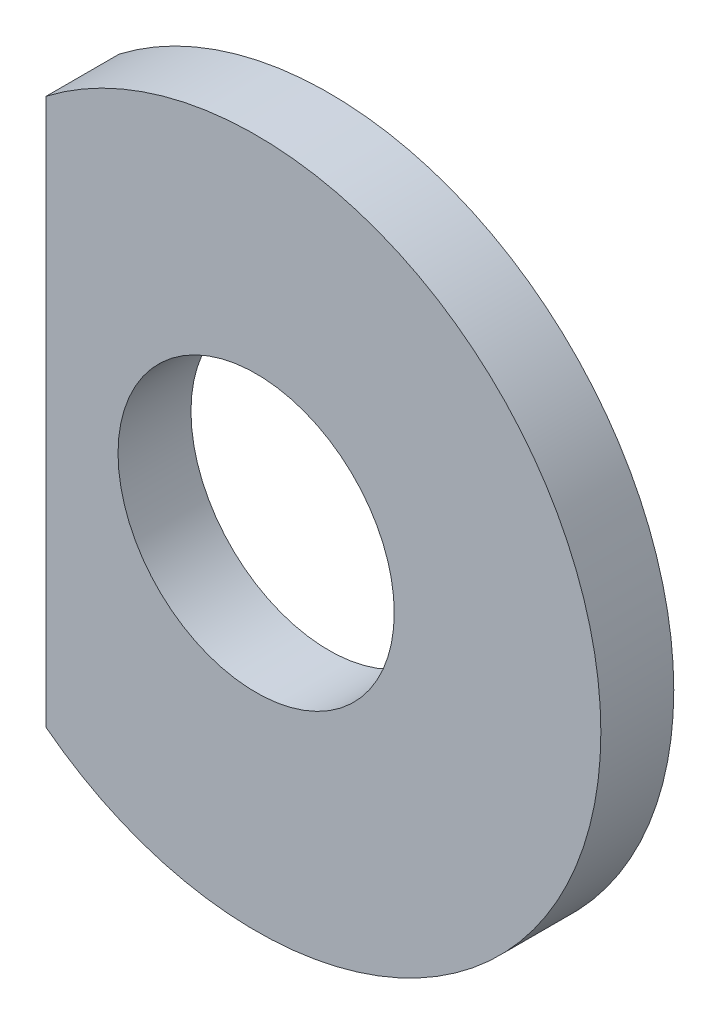
ISO-10303-21;
HEADER;
FILE_DESCRIPTION(('STEP AP214'),'2;1');
FILE_NAME('part.step','',(''),(''),'','','');
FILE_SCHEMA(('AUTOMOTIVE_DESIGN { 1 0 10303 214 1 1 1 1 }'));
ENDSEC;
DATA;
#1=APPLICATION_CONTEXT('core data for automotive mechanical design processes');
#2=APPLICATION_PROTOCOL_DEFINITION('international standard','automotive_design',2000,#1);
#3=PRODUCT_CONTEXT('',#1,'mechanical');
#4=PRODUCT('Part','Part','',(#3));
#5=PRODUCT_RELATED_PRODUCT_CATEGORY('part','',(#4));
#6=PRODUCT_DEFINITION_FORMATION('','',#4);
#7=PRODUCT_DEFINITION_CONTEXT('part definition',#1,'design');
#8=PRODUCT_DEFINITION('design','',#6,#7);
#9=PRODUCT_DEFINITION_SHAPE('','',#8);
#10=(LENGTH_UNIT() NAMED_UNIT(*) SI_UNIT(.MILLI.,.METRE.));
#11=(NAMED_UNIT(*) PLANE_ANGLE_UNIT() SI_UNIT($,.RADIAN.));
#12=(NAMED_UNIT(*) SI_UNIT($,.STERADIAN.) SOLID_ANGLE_UNIT());
#13=UNCERTAINTY_MEASURE_WITH_UNIT(LENGTH_MEASURE(1.E-05),#10,'distance_accuracy_value','');
#14=(GEOMETRIC_REPRESENTATION_CONTEXT(3) GLOBAL_UNCERTAINTY_ASSIGNED_CONTEXT((#13)) GLOBAL_UNIT_ASSIGNED_CONTEXT((#10,
#11,#12)) REPRESENTATION_CONTEXT('',''));
#15=CARTESIAN_POINT('',(0.,0.,0.));
#16=DIRECTION('',(0.,0.,1.));
#17=DIRECTION('',(1.,0.,0.));
#18=AXIS2_PLACEMENT_3D('',#15,#16,#17);
#19=CARTESIAN_POINT('',(0.,0.,-0.8382));
#20=DIRECTION('',(0.,0.,1.));
#21=DIRECTION('',(1.,0.,0.));
#22=AXIS2_PLACEMENT_3D('',#19,#20,#21);
#23=CYLINDRICAL_SURFACE('',#22,3.9624);
#24=CARTESIAN_POINT('',(0.,0.,0.));
#25=DIRECTION('',(0.,0.,1.));
#26=DIRECTION('',(1.,0.,0.));
#27=AXIS2_PLACEMENT_3D('',#24,#25,#26);
#28=CIRCLE('',#27,3.9624);
#29=CARTESIAN_POINT('',(-2.413,-3.14293569135609,0.));
#30=VERTEX_POINT('',#29);
#31=CARTESIAN_POINT('',(-2.413,3.14293569135609,0.));
#32=VERTEX_POINT('',#31);
#33=EDGE_CURVE('E61',#30,#32,#28,.T.);
#34=ORIENTED_EDGE('',*,*,#33,.F.);
#35=DIRECTION('',(0.,0.,1.));
#36=VECTOR('',#35,1.);
#37=CARTESIAN_POINT('',(-2.413,-3.14293569135609,-0.8382));
#38=LINE('',#37,#36);
#39=CARTESIAN_POINT('',(-2.413,-3.14293569135609,-0.8382));
#40=VERTEX_POINT('',#39);
#41=EDGE_CURVE('E11',#40,#30,#38,.T.);
#42=ORIENTED_EDGE('',*,*,#41,.F.);
#43=CARTESIAN_POINT('',(0.,0.,-0.8382));
#44=DIRECTION('',(0.,0.,1.));
#45=DIRECTION('',(1.,0.,0.));
#46=AXIS2_PLACEMENT_3D('',#43,#44,#45);
#47=CIRCLE('',#46,3.9624);
#48=CARTESIAN_POINT('',(-2.413,3.14293569135609,-0.8382));
#49=VERTEX_POINT('',#48);
#50=EDGE_CURVE('E66',#40,#49,#47,.T.);
#51=ORIENTED_EDGE('',*,*,#50,.T.);
#52=DIRECTION('',(0.,0.,1.));
#53=VECTOR('',#52,1.);
#54=CARTESIAN_POINT('',(-2.413,3.14293569135609,-0.8382));
#55=LINE('',#54,#53);
#56=EDGE_CURVE('E35',#49,#32,#55,.T.);
#57=ORIENTED_EDGE('',*,*,#56,.T.);
#58=EDGE_LOOP('',(#34,#42,#51,#57));
#59=FACE_BOUND('',#58,.T.);
#60=ADVANCED_FACE('F32',(#59),#23,.T.);
#61=CARTESIAN_POINT('',(-2.413,3.14293569135609,-0.8382));
#62=DIRECTION('',(-1.,0.,0.));
#63=DIRECTION('',(0.,0.,1.));
#64=AXIS2_PLACEMENT_3D('',#61,#62,#63);
#65=PLANE('',#64);
#66=DIRECTION('',(0.,-1.,0.));
#67=VECTOR('',#66,1.);
#68=CARTESIAN_POINT('',(-2.413,3.14293569135609,0.));
#69=LINE('',#68,#67);
#70=EDGE_CURVE('E58',#32,#30,#69,.T.);
#71=ORIENTED_EDGE('',*,*,#70,.F.);
#72=ORIENTED_EDGE('',*,*,#56,.F.);
#73=DIRECTION('',(0.,-1.,0.));
#74=VECTOR('',#73,1.);
#75=CARTESIAN_POINT('',(-2.413,3.14293569135609,-0.8382));
#76=LINE('',#75,#74);
#77=EDGE_CURVE('E60',#49,#40,#76,.T.);
#78=ORIENTED_EDGE('',*,*,#77,.T.);
#79=ORIENTED_EDGE('',*,*,#41,.T.);
#80=EDGE_LOOP('',(#71,#72,#78,#79));
#81=FACE_BOUND('',#80,.T.);
#82=ADVANCED_FACE('F56',(#81),#65,.T.);
#83=CARTESIAN_POINT('',(0.,0.,-0.8382));
#84=DIRECTION('',(0.,0.,1.));
#85=DIRECTION('',(1.,0.,0.));
#86=AXIS2_PLACEMENT_3D('',#83,#84,#85);
#87=PLANE('',#86);
#88=CARTESIAN_POINT('',(0.,0.,-0.8382));
#89=DIRECTION('',(0.,0.,1.));
#90=DIRECTION('',(1.,0.,0.));
#91=AXIS2_PLACEMENT_3D('',#88,#89,#90);
#92=CIRCLE('',#91,1.5875);
#93=CARTESIAN_POINT('',(1.5875,0.,-0.8382));
#94=VERTEX_POINT('',#93);
#95=EDGE_CURVE('E63',#94,#94,#92,.T.);
#96=ORIENTED_EDGE('',*,*,#95,.T.);
#97=EDGE_LOOP('',(#96));
#98=FACE_BOUND('',#97,.T.);
#99=ORIENTED_EDGE('',*,*,#50,.F.);
#100=ORIENTED_EDGE('',*,*,#77,.F.);
#101=EDGE_LOOP('',(#99,#100));
#102=FACE_BOUND('',#101,.T.);
#103=ADVANCED_FACE('F77',(#98,#102),#87,.F.);
#104=CARTESIAN_POINT('',(0.,0.,0.));
#105=DIRECTION('',(0.,0.,1.));
#106=DIRECTION('',(1.,0.,0.));
#107=AXIS2_PLACEMENT_3D('',#104,#105,#106);
#108=PLANE('',#107);
#109=CARTESIAN_POINT('',(0.,0.,0.));
#110=DIRECTION('',(0.,0.,1.));
#111=DIRECTION('',(1.,0.,0.));
#112=AXIS2_PLACEMENT_3D('',#109,#110,#111);
#113=CIRCLE('',#112,1.5875);
#114=CARTESIAN_POINT('',(1.5875,0.,0.));
#115=VERTEX_POINT('',#114);
#116=EDGE_CURVE('E71',#115,#115,#113,.T.);
#117=ORIENTED_EDGE('',*,*,#116,.F.);
#118=EDGE_LOOP('',(#117));
#119=FACE_BOUND('',#118,.T.);
#120=ORIENTED_EDGE('',*,*,#33,.T.);
#121=ORIENTED_EDGE('',*,*,#70,.T.);
#122=EDGE_LOOP('',(#120,#121));
#123=FACE_BOUND('',#122,.T.);
#124=ADVANCED_FACE('F65',(#119,#123),#108,.T.);
#125=CARTESIAN_POINT('',(0.,0.,-0.8382));
#126=DIRECTION('',(0.,0.,1.));
#127=DIRECTION('',(1.,0.,0.));
#128=AXIS2_PLACEMENT_3D('',#125,#126,#127);
#129=CYLINDRICAL_SURFACE('',#128,1.5875);
#130=ORIENTED_EDGE('',*,*,#95,.F.);
#131=EDGE_LOOP('',(#130));
#132=FACE_BOUND('',#131,.T.);
#133=ORIENTED_EDGE('',*,*,#116,.T.);
#134=EDGE_LOOP('',(#133));
#135=FACE_BOUND('',#134,.T.);
#136=ADVANCED_FACE('F80',(#132,#135),#129,.F.);
#137=CLOSED_SHELL('',(#60,#82,#103,#124,#136));
#138=MANIFOLD_SOLID_BREP('B2',#137);
#139=ADVANCED_BREP_SHAPE_REPRESENTATION('',(#18,#138),#14);
#140=SHAPE_DEFINITION_REPRESENTATION(#9,#139);
ENDSEC;
END-ISO-10303-21;
